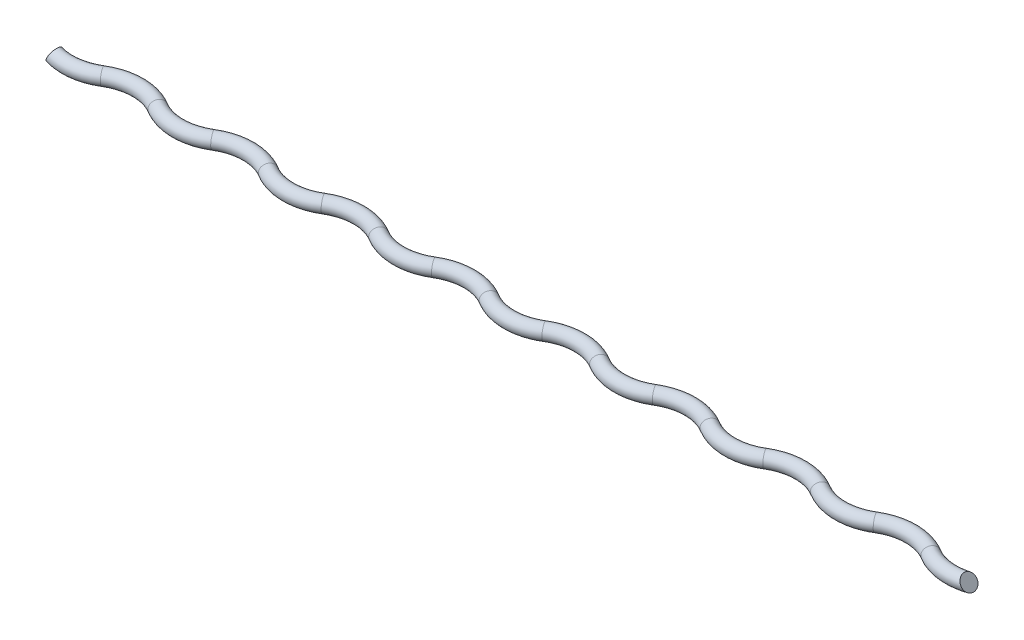
ISO-10303-21;
HEADER;
FILE_DESCRIPTION(('STEP AP214'),'2;1');
FILE_NAME('part.step','',(''),(''),'','','');
FILE_SCHEMA(('AUTOMOTIVE_DESIGN { 1 0 10303 214 1 1 1 1 }'));
ENDSEC;
DATA;
#1=APPLICATION_CONTEXT('core data for automotive mechanical design processes');
#2=APPLICATION_PROTOCOL_DEFINITION('international standard','automotive_design',2000,#1);
#3=PRODUCT_CONTEXT('',#1,'mechanical');
#4=PRODUCT('Part','Part','',(#3));
#5=PRODUCT_RELATED_PRODUCT_CATEGORY('part','',(#4));
#6=PRODUCT_DEFINITION_FORMATION('','',#4);
#7=PRODUCT_DEFINITION_CONTEXT('part definition',#1,'design');
#8=PRODUCT_DEFINITION('design','',#6,#7);
#9=PRODUCT_DEFINITION_SHAPE('','',#8);
#10=(LENGTH_UNIT() NAMED_UNIT(*) SI_UNIT(.MILLI.,.METRE.));
#11=(NAMED_UNIT(*) PLANE_ANGLE_UNIT() SI_UNIT($,.RADIAN.));
#12=(NAMED_UNIT(*) SI_UNIT($,.STERADIAN.) SOLID_ANGLE_UNIT());
#13=UNCERTAINTY_MEASURE_WITH_UNIT(LENGTH_MEASURE(1.E-05),#10,'distance_accuracy_value','');
#14=(GEOMETRIC_REPRESENTATION_CONTEXT(3) GLOBAL_UNCERTAINTY_ASSIGNED_CONTEXT((#13)) GLOBAL_UNIT_ASSIGNED_CONTEXT((#10,
#11,#12)) REPRESENTATION_CONTEXT('',''));
#15=CARTESIAN_POINT('',(0.,0.,0.));
#16=DIRECTION('',(0.,0.,1.));
#17=DIRECTION('',(1.,0.,0.));
#18=AXIS2_PLACEMENT_3D('',#15,#16,#17);
#19=CARTESIAN_POINT('',(0.,0.,29.778888860546));
#20=DIRECTION('',(0.,0.,-1.));
#21=DIRECTION('',(-1.,0.,0.));
#22=AXIS2_PLACEMENT_3D('',#19,#20,#21);
#23=CYLINDRICAL_SURFACE('',#22,6.9);
#24=CARTESIAN_POINT('',(-6.241891224204,2.940883191356,0.531991398741));
#25=CARTESIAN_POINT('',(-6.239782427795,2.945359016115,0.529307884147));
#26=CARTESIAN_POINT('',(-6.237596340689,2.949986380057,0.52714711403));
#27=CARTESIAN_POINT('',(-6.233084561044,2.959507493956,0.523749412374));
#28=CARTESIAN_POINT('',(-6.230758740171,2.964401534445,0.522513456909));
#29=CARTESIAN_POINT('',(-6.225992600269,2.974398516478,0.520930137149));
#30=CARTESIAN_POINT('',(-6.223615838161,2.979368424539,0.520594951872));
#31=CARTESIAN_POINT('',(-6.218853479753,2.989296189324,0.520718218552));
#32=CARTESIAN_POINT('',(-6.216467886433,2.994254039292,0.521177501985));
#33=CARTESIAN_POINT('',(-6.211335863558,3.004887116495,0.522968344035));
#34=CARTESIAN_POINT('',(-6.208648440606,3.010435347775,0.524395843947));
#35=CARTESIAN_POINT('',(-6.203371346104,3.021294488214,0.5280922487));
#36=CARTESIAN_POINT('',(-6.200781765213,3.026605183967,0.530361914112));
#37=CARTESIAN_POINT('',(-6.195223815227,3.037967911019,0.53623010734));
#38=CARTESIAN_POINT('',(-6.192346779357,3.043826515811,0.539920585466));
#39=CARTESIAN_POINT('',(-6.186862856724,3.054957689763,0.54826080338));
#40=CARTESIAN_POINT('',(-6.18425593003,3.060230259129,0.55291051666));
#41=CARTESIAN_POINT('',(-6.179157715177,3.070512208239,0.563615985807));
#42=CARTESIAN_POINT('',(-6.176767591055,3.075315417706,0.569583715149));
#43=CARTESIAN_POINT('',(-6.172506067445,3.083859860571,0.582394638996));
#44=CARTESIAN_POINT('',(-6.170633626801,3.087603089706,0.589236166347));
#45=CARTESIAN_POINT('',(-6.167932398996,3.092994724198,0.601936889));
#46=CARTESIAN_POINT('',(-6.166990679978,3.094871345459,0.607409853611));
#47=CARTESIAN_POINT('',(-6.165518189469,3.097803761893,0.618622134497));
#48=CARTESIAN_POINT('',(-6.164986960096,3.098860471782,0.624361153963));
#49=CARTESIAN_POINT('',(-6.164387426574,3.100052919559,0.636188019141));
#50=CARTESIAN_POINT('',(-6.164333195713,3.100160712225,0.642083739985));
#51=CARTESIAN_POINT('',(-6.164724121057,3.099383277467,0.653790627813));
#52=CARTESIAN_POINT('',(-6.165168831571,3.098498966372,0.659601872304));
#53=CARTESIAN_POINT('',(-6.166520913174,3.095807134885,0.670441518513));
#54=CARTESIAN_POINT('',(-6.167345811678,3.094163975925,0.67530992615));
#55=CARTESIAN_POINT('',(-6.169364066687,3.090137874497,0.684648124614));
#56=CARTESIAN_POINT('',(-6.170557396942,3.087755007317,0.689117953578));
#57=CARTESIAN_POINT('',(-6.173245564332,3.082376959198,0.697401122881));
#58=CARTESIAN_POINT('',(-6.174681431931,3.079500189047,0.70112028749));
#59=CARTESIAN_POINT('',(-6.177796038679,3.073247192247,0.707995327244));
#60=CARTESIAN_POINT('',(-6.179474873253,3.069870792796,0.711151002351));
#61=CARTESIAN_POINT('',(-6.183132023286,3.062498303976,0.716991720498));
#62=CARTESIAN_POINT('',(-6.185069675028,3.058583614607,0.719581022991));
#63=CARTESIAN_POINT('',(-6.189089325861,3.050441595738,0.724064672878));
#64=CARTESIAN_POINT('',(-6.191171422946,3.046214084549,0.725958603796));
#65=CARTESIAN_POINT('',(-6.195661585413,3.037071886042,0.729194100211));
#66=CARTESIAN_POINT('',(-6.198024187747,3.032247632247,0.730432954696));
#67=CARTESIAN_POINT('',(-6.202793056439,3.02248041088,0.732094414012));
#68=CARTESIAN_POINT('',(-6.205199364719,3.01753736601,0.73251644897));
#69=CARTESIAN_POINT('',(-6.210311971832,3.007002334306,0.732556469636));
#70=CARTESIAN_POINT('',(-6.212956831456,3.001533520284,0.732084668111));
#71=CARTESIAN_POINT('',(-6.218172034531,2.99071439825,0.730232650244));
#72=CARTESIAN_POINT('',(-6.220742335274,2.98536416691,0.728851861771));
#73=CARTESIAN_POINT('',(-6.226059286567,2.97426079791,0.725001114245));
#74=CARTESIAN_POINT('',(-6.228727837541,2.968667229683,0.722489155385));
#75=CARTESIAN_POINT('',(-6.233852277283,2.957891373895,0.716536346318));
#76=CARTESIAN_POINT('',(-6.236308079102,2.952709225291,0.713095169253));
#77=CARTESIAN_POINT('',(-6.241166009053,2.942427797755,0.704994841612));
#78=CARTESIAN_POINT('',(-6.24348552537,2.937501292158,0.700381994231));
#79=CARTESIAN_POINT('',(-6.24776555632,2.928387081688,0.690333628749));
#80=CARTESIAN_POINT('',(-6.249726117583,2.92419920694,0.684898284511));
#81=CARTESIAN_POINT('',(-6.253304688956,2.916538816351,0.67304742224));
#82=CARTESIAN_POINT('',(-6.254862310473,2.913195357524,0.666792936788));
#83=CARTESIAN_POINT('',(-6.257491514701,2.907543577922,0.653739815238));
#84=CARTESIAN_POINT('',(-6.258563610664,2.905234101682,0.646941780664));
#85=CARTESIAN_POINT('',(-6.260133224354,2.901850326977,0.633087795192));
#86=CARTESIAN_POINT('',(-6.260630218471,2.90077740499,0.626285863697));
#87=CARTESIAN_POINT('',(-6.26107916696,2.899808261037,0.612584275882));
#88=CARTESIAN_POINT('',(-6.261032127897,2.899909900493,0.605684797678));
#89=CARTESIAN_POINT('',(-6.260353409751,2.901374804484,0.59260838826));
#90=CARTESIAN_POINT('',(-6.259803133813,2.9025623566,0.586669241285));
#91=CARTESIAN_POINT('',(-6.258226482142,2.905960221038,0.575161125268));
#92=CARTESIAN_POINT('',(-6.257200695251,2.908169339351,0.569591719505));
#93=CARTESIAN_POINT('',(-6.254802407139,2.913323474317,0.559677936022));
#94=CARTESIAN_POINT('',(-6.253543660196,2.916025181275,0.555438398318));
#95=CARTESIAN_POINT('',(-6.250716130488,2.922081282898,0.547573930899));
#96=CARTESIAN_POINT('',(-6.249147370618,2.925435661165,0.543948980305));
#97=CARTESIAN_POINT('',(-6.24655220276,2.930970778101,0.539004244715));
#98=CARTESIAN_POINT('',(-6.245660543327,2.932870447609,0.537463377154));
#99=CARTESIAN_POINT('',(-6.243819281415,2.936788290968,0.534579504205));
#100=CARTESIAN_POINT('',(-6.242869675682,2.938806472461,0.533236511266));
#101=CARTESIAN_POINT('',(-6.241891224204,2.940883191356,0.531991398741));
#102=(BOUNDED_CURVE() B_SPLINE_CURVE(3,(#24,#25,#26,#27,#28,#29,#30,#31,#32,#33,#34,#35,#36,#37,
#38,#39,#40,#41,#42,#43,#44,#45,#46,#47,#48,#49,#50,#51,#52,#53,#54,#55,#56,#57,#58,#59,#60,#61,
#62,#63,#64,#65,#66,#67,#68,#69,#70,#71,#72,#73,#74,#75,#76,#77,#78,#79,#80,#81,#82,#83,#84,#85,
#86,#87,#88,#89,#90,#91,#92,#93,#94,#95,#96,#97,#98,#99,#100,#101),.UNSPECIFIED.,.T.,
.F.) B_SPLINE_CURVE_WITH_KNOTS((4,2,2,2,2,2,2,2,2,2,2,2,2,2,2,2,2,2,2,2,2,2,2,2,2,2,2,2,2,2,2,2,
2,2,2,2,2,2,4),(0.,0.01660543734046,0.03321087468092,0.04967014944875,0.06612942421659,
0.08501189757697,0.103894370937,0.126315963759,0.148737556581,0.172797695858,0.196857835135,
0.214345051209,0.231832267282,0.249462489139,0.267092710996,0.28261358536,0.298134459724,
0.312772644169,0.327410828613,0.342525923069,0.357641017525,0.374058472929,0.390475928334,
0.408637076379,0.426798224424,0.446750663858,0.466703103292,0.488018606402,0.509334109513,
0.531042938953,0.552751768394,0.573402723967,0.594053679539,0.612225295992,0.630396912444,
0.645834767134,0.661272621824,0.66895167405,0.676630726276),
.UNSPECIFIED.) CURVE() GEOMETRIC_REPRESENTATION_ITEM() RATIONAL_B_SPLINE_CURVE((1.,1.,1.,1.,1.,
1.,1.,1.,1.,1.,1.,1.,1.,1.,1.,1.,1.,1.,1.,1.,1.,1.,1.,1.,1.,1.,1.,1.,1.,1.,1.,1.,1.,1.,1.,1.,1.,
1.,1.,1.,1.,1.,1.,1.,1.,1.,1.,1.,1.,1.,1.,1.,1.,1.,1.,1.,1.,1.,1.,1.,1.,1.,1.,1.,1.,1.,1.,1.,1.,
1.,1.,1.,1.,1.,1.,1.,1.,1.)) REPRESENTATION_ITEM(''));
#103=CARTESIAN_POINT('',(-6.241891224204,2.940883191356,0.531991398741));
#104=VERTEX_POINT('',#103);
#105=EDGE_CURVE('E216',#104,#104,#102,.T.);
#106=ORIENTED_EDGE('',*,*,#105,.F.);
#107=EDGE_LOOP('',(#106));
#108=FACE_BOUND('',#107,.T.);
#109=ADVANCED_FACE('F17',(#108),#23,.T.);
#110=CARTESIAN_POINT('',(0.,0.,29.778888860546));
#111=DIRECTION('',(0.,0.,-1.));
#112=DIRECTION('',(-1.,0.,0.));
#113=AXIS2_PLACEMENT_3D('',#110,#111,#112);
#114=CYLINDRICAL_SURFACE('',#113,6.9);
#115=CARTESIAN_POINT('',(6.202204122049,3.02368385061,0.529231335371));
#116=CARTESIAN_POINT('',(6.198679032724,3.030914541588,0.532299487386));
#117=CARTESIAN_POINT('',(6.195323919679,3.037764642102,0.536055628824));
#118=CARTESIAN_POINT('',(6.188930936005,3.05076815899,0.544831740269));
#119=CARTESIAN_POINT('',(6.18589311299,3.056921327363,0.549852112583));
#120=CARTESIAN_POINT('',(6.180335564168,3.068140994659,0.560917559287));
#121=CARTESIAN_POINT('',(6.17788020694,3.073079992456,0.566719211057));
#122=CARTESIAN_POINT('',(6.173465678093,3.081938677641,0.579215378207));
#123=CARTESIAN_POINT('',(6.171505581997,3.08586012492,0.585908328212));
#124=CARTESIAN_POINT('',(6.168603997956,3.09165527249,0.598466672913));
#125=CARTESIAN_POINT('',(6.167564764618,3.093727253964,0.603955045603));
#126=CARTESIAN_POINT('',(6.165898840001,3.097046164098,0.615233115015));
#127=CARTESIAN_POINT('',(6.165271669903,3.098294046875,0.62102246302));
#128=CARTESIAN_POINT('',(6.164482814509,3.09986328851,0.632993634982));
#129=CARTESIAN_POINT('',(6.164338652977,3.100149840505,0.63898035452));
#130=CARTESIAN_POINT('',(6.164562528029,3.099704647251,0.650903984854));
#131=CARTESIAN_POINT('',(6.164930058598,3.098973938814,0.656840946061));
#132=CARTESIAN_POINT('',(6.166149700691,3.096546378579,0.667917069663));
#133=CARTESIAN_POINT('',(6.166916313922,3.095019827984,0.672886753336));
#134=CARTESIAN_POINT('',(6.16883051755,3.091202776312,0.682444581769));
#135=CARTESIAN_POINT('',(6.169978060766,3.088912393019,0.687032783038));
#136=CARTESIAN_POINT('',(6.17257997606,3.083709509084,0.695523951409));
#137=CARTESIAN_POINT('',(6.173972376191,3.080921401303,0.699331237386));
#138=CARTESIAN_POINT('',(6.177008658206,3.074829364277,0.70639367938));
#139=CARTESIAN_POINT('',(6.178652631779,3.071525269968,0.709648653903));
#140=CARTESIAN_POINT('',(6.182237632455,3.064303271212,0.715683691667));
#141=CARTESIAN_POINT('',(6.184137553134,3.060467712877,0.718368854233));
#142=CARTESIAN_POINT('',(6.188089416231,3.052469373209,0.723054446122));
#143=CARTESIAN_POINT('',(6.190141458912,3.048306406043,0.725054474866));
#144=CARTESIAN_POINT('',(6.194570554256,3.039296448256,0.728516511375));
#145=CARTESIAN_POINT('',(6.19690307645,3.034538039985,0.729875865091));
#146=CARTESIAN_POINT('',(6.201620372596,3.024885718375,0.731787383389));
#147=CARTESIAN_POINT('',(6.204005194557,3.019991716421,0.732338986196));
#148=CARTESIAN_POINT('',(6.209080083102,3.009545100732,0.732661666803));
#149=CARTESIAN_POINT('',(6.211710164511,3.004112608814,0.73234080011));
#150=CARTESIAN_POINT('',(6.21690606657,2.993345067608,0.73079608099));
#151=CARTESIAN_POINT('',(6.219471851098,2.988010083395,0.729571648573));
#152=CARTESIAN_POINT('',(6.224793792604,2.976908435207,0.72605352317));
#153=CARTESIAN_POINT('',(6.22747292541,2.971298866097,0.723712489844));
#154=CARTESIAN_POINT('',(6.232630148949,2.960465742885,0.718099244476));
#155=CARTESIAN_POINT('',(6.235108152036,2.955242331736,0.714826675446));
#156=CARTESIAN_POINT('',(6.240032121583,2.944831846736,0.70706299833));
#157=CARTESIAN_POINT('',(6.242395045828,2.939818119609,0.702609788717));
#158=CARTESIAN_POINT('',(6.246773378287,2.930503172646,0.692866281008));
#159=CARTESIAN_POINT('',(6.248788811509,2.926201830166,0.687576111355));
#160=CARTESIAN_POINT('',(6.252500165848,2.918263407532,0.675978982158));
#161=CARTESIAN_POINT('',(6.254132609608,2.914761775619,0.669823740073));
#162=CARTESIAN_POINT('',(6.256919946433,2.908773571646,0.656939968258));
#163=CARTESIAN_POINT('',(6.258075303847,2.906285945573,0.650212027014));
#164=CARTESIAN_POINT('',(6.259824026743,2.902517404299,0.636424317528));
#165=CARTESIAN_POINT('',(6.260410714041,2.901251152816,0.629613875942));
#166=CARTESIAN_POINT('',(6.261039686279,2.899893550982,0.615855462045));
#167=CARTESIAN_POINT('',(6.261082963092,2.899800086363,0.608907737768));
#168=CARTESIAN_POINT('',(6.26057463685,2.900897367847,0.595662410389));
#169=CARTESIAN_POINT('',(6.260098516985,2.901925133624,0.589609574808));
#170=CARTESIAN_POINT('',(6.258659608224,2.905027165432,0.577842395181));
#171=CARTESIAN_POINT('',(6.257697469821,2.907100105582,0.572127618093));
#172=CARTESIAN_POINT('',(6.255404498559,2.912030355756,0.561916315669));
#173=CARTESIAN_POINT('',(6.254188171226,2.914642506847,0.557535466958));
#174=CARTESIAN_POINT('',(6.251431742909,2.920549911844,0.549378647295));
#175=CARTESIAN_POINT('',(6.249891687793,2.923845103156,0.545602615433));
#176=CARTESIAN_POINT('',(6.246635936409,2.930793869284,0.539032534331));
#177=CARTESIAN_POINT('',(6.244999784194,2.93427914328,0.536273751374));
#178=CARTESIAN_POINT('',(6.241551653523,2.941606593628,0.5314178446));
#179=CARTESIAN_POINT('',(6.239739605465,2.945448931347,0.529321012931));
#180=CARTESIAN_POINT('',(6.235901000342,2.953567214007,0.525742997826));
#181=CARTESIAN_POINT('',(6.23392003711,2.957746287819,0.524320624486));
#182=CARTESIAN_POINT('',(6.229881003431,2.966244227178,0.522165084958));
#183=CARTESIAN_POINT('',(6.227822885463,2.970563200113,0.521432426473));
#184=CARTESIAN_POINT('',(6.223351329312,2.979920906046,0.520566670618));
#185=CARTESIAN_POINT('',(6.220980575383,2.984866916522,0.520536183486));
#186=CARTESIAN_POINT('',(6.216247557446,2.994711360579,0.52123171015));
#187=CARTESIAN_POINT('',(6.213885311662,2.999609752716,0.521958459155));
#188=CARTESIAN_POINT('',(6.209940071316,3.007766212943,0.523773961603));
#189=CARTESIAN_POINT('',(6.208370284013,3.011004992523,0.524659958055));
#190=CARTESIAN_POINT('',(6.205263066567,3.01740334114,0.526726470327));
#191=CARTESIAN_POINT('',(6.20372564265,3.020562895573,0.527907040844));
#192=CARTESIAN_POINT('',(6.202204122049,3.02368385061,0.529231335371));
#193=(BOUNDED_CURVE() B_SPLINE_CURVE(3,(#115,#116,#117,#118,#119,#120,#121,#122,#123,#124,#125,
#126,#127,#128,#129,#130,#131,#132,#133,#134,#135,#136,#137,#138,#139,#140,#141,#142,#143,#144,
#145,#146,#147,#148,#149,#150,#151,#152,#153,#154,#155,#156,#157,#158,#159,#160,#161,#162,#163,
#164,#165,#166,#167,#168,#169,#170,#171,#172,#173,#174,#175,#176,#177,#178,#179,#180,#181,#182,
#183,#184,#185,#186,#187,#188,#189,#190,#191,#192),.UNSPECIFIED.,.T.,
.F.) B_SPLINE_CURVE_WITH_KNOTS((4,2,2,2,2,2,2,2,2,2,2,2,2,2,2,2,2,2,2,2,2,2,2,2,2,2,2,2,2,2,2,2,
2,2,2,2,2,2,4),(0.,0.02541080623336,0.05082161246671,0.07473532044338,0.09864902842004,
0.116366403749,0.134083779077,0.151953688241,0.169823597404,0.185447858732,0.20107212006,
0.215673827527,0.230275534993,0.245265915272,0.260256295551,0.276493847349,0.292731399147,
0.310685119283,0.328638839419,0.348390380794,0.36814192217,0.38930551459,0.410469107009,
0.432122217796,0.453775328582,0.474500310439,0.495225292296,0.513566325309,0.531907358322,
0.547479123955,0.563050889589,0.577079373177,0.591107856765,0.605425469013,0.61974308126,
0.63597976239,0.65221644352,0.663141409037,0.674066374554),
.UNSPECIFIED.) CURVE() GEOMETRIC_REPRESENTATION_ITEM() RATIONAL_B_SPLINE_CURVE((1.,1.,1.,1.,1.,
1.,1.,1.,1.,1.,1.,1.,1.,1.,1.,1.,1.,1.,1.,1.,1.,1.,1.,1.,1.,1.,1.,1.,1.,1.,1.,1.,1.,1.,1.,1.,1.,
1.,1.,1.,1.,1.,1.,1.,1.,1.,1.,1.,1.,1.,1.,1.,1.,1.,1.,1.,1.,1.,1.,1.,1.,1.,1.,1.,1.,1.,1.,1.,1.,
1.,1.,1.,1.,1.,1.,1.,1.,1.)) REPRESENTATION_ITEM(''));
#194=CARTESIAN_POINT('',(6.202204122049,3.02368385061,0.529231335371));
#195=VERTEX_POINT('',#194);
#196=EDGE_CURVE('E30',#195,#195,#193,.T.);
#197=ORIENTED_EDGE('',*,*,#196,.T.);
#198=EDGE_LOOP('',(#197));
#199=FACE_BOUND('',#198,.T.);
#200=ADVANCED_FACE('F470',(#199),#114,.T.);
#201=CARTESIAN_POINT('',(6.,3.,-0.06214285714286));
#202=DIRECTION('',(0.,1.,0.));
#203=DIRECTION('',(0.,0.,1.));
#204=AXIS2_PLACEMENT_3D('',#201,#202,#203);
#205=TOROIDAL_SURFACE('',#204,0.722142857143,0.1);
#206=ORIENTED_EDGE('',*,*,#196,.F.);
#207=CARTESIAN_POINT('',(5.67545135924,3.02368385061,0.471971477364));
#208=CARTESIAN_POINT('',(5.76897244613,3.02368385061,0.52879852669));
#209=CARTESIAN_POINT('',(5.874929829952,3.02368385061,0.565165346776));
#210=CARTESIAN_POINT('',(5.987360470787,3.02368385061,0.577386948606));
#211=CARTESIAN_POINT('',(6.098657084141,3.02368385061,0.564636393887));
#212=CARTESIAN_POINT('',(6.202204122049,3.02368385061,0.529231335371));
#213=(BOUNDED_CURVE() B_SPLINE_CURVE(5,(#207,#208,#209,#210,#211,#212),.UNSPECIFIED.,.F.,
.F.) B_SPLINE_CURVE_WITH_KNOTS((6,6),(-0.546017406173,0.329460753161),
.UNSPECIFIED.) CURVE() GEOMETRIC_REPRESENTATION_ITEM() RATIONAL_B_SPLINE_CURVE((1.,1.,1.,1.,1.,1.)) REPRESENTATION_ITEM(''));
#214=CARTESIAN_POINT('',(5.67545135924,3.02368385061,0.471971477364));
#215=VERTEX_POINT('',#214);
#216=EDGE_CURVE('E11',#215,#195,#213,.T.);
#217=ORIENTED_EDGE('',*,*,#216,.F.);
#218=CARTESIAN_POINT('',(5.625,3.,0.555));
#219=DIRECTION('',(0.854599406528091,0.,0.519287833828056));
#220=DIRECTION('',(0.519287833828056,0.,-0.854599406528091));
#221=AXIS2_PLACEMENT_3D('',#218,#219,#220);
#222=CIRCLE('',#221,0.1);
#223=CARTESIAN_POINT('',(5.676928783383,3.,0.469540059347));
#224=VERTEX_POINT('',#223);
#225=EDGE_CURVE('E175',#215,#224,#222,.T.);
#226=ORIENTED_EDGE('',*,*,#225,.T.);
#227=CARTESIAN_POINT('',(5.625,3.,0.555));
#228=DIRECTION('',(0.854599406528091,0.,0.519287833828056));
#229=DIRECTION('',(0.519287833828056,0.,-0.854599406528091));
#230=AXIS2_PLACEMENT_3D('',#227,#228,#229);
#231=CIRCLE('',#230,0.1);
#232=EDGE_CURVE('E178',#224,#215,#231,.T.);
#233=ORIENTED_EDGE('',*,*,#232,.T.);
#234=ORIENTED_EDGE('',*,*,#216,.T.);
#235=EDGE_LOOP('',(#206,#217,#226,#233,#234));
#236=FACE_BOUND('',#235,.T.);
#237=ADVANCED_FACE('F474',(#236),#205,.T.);
#238=CARTESIAN_POINT('',(5.25,3.,1.172142857143));
#239=DIRECTION('',(0.,-1.,0.));
#240=DIRECTION('',(0.,0.,-1.));
#241=AXIS2_PLACEMENT_3D('',#238,#239,#240);
#242=TOROIDAL_SURFACE('',#241,0.722142857143,0.1);
#243=CARTESIAN_POINT('',(4.875,3.,0.555));
#244=DIRECTION('',(0.854599406528091,0.,-0.519287833828056));
#245=DIRECTION('',(-0.519287833828056,0.,-0.854599406528091));
#246=AXIS2_PLACEMENT_3D('',#243,#244,#245);
#247=CIRCLE('',#246,0.1);
#248=CARTESIAN_POINT('',(4.823071216617,3.,0.469540059347));
#249=VERTEX_POINT('',#248);
#250=EDGE_CURVE('E165',#249,#249,#247,.T.);
#251=ORIENTED_EDGE('',*,*,#250,.T.);
#252=CARTESIAN_POINT('',(4.823071216617,3.,0.469540059347));
#253=CARTESIAN_POINT('',(4.976524559506,3.,0.376295840578));
#254=CARTESIAN_POINT('',(5.155431518956,3.,0.32490242308));
#255=CARTESIAN_POINT('',(5.344568481044,3.,0.32490242308));
#256=CARTESIAN_POINT('',(5.523475440494,3.,0.376295840578));
#257=CARTESIAN_POINT('',(5.676928783383,3.,0.469540059347));
#258=(BOUNDED_CURVE() B_SPLINE_CURVE(5,(#252,#253,#254,#255,#256,#257),.UNSPECIFIED.,.F.,
.F.) B_SPLINE_CURVE_WITH_KNOTS((6,6),(5.737167901006,6.829202713353),
.UNSPECIFIED.) CURVE() GEOMETRIC_REPRESENTATION_ITEM() RATIONAL_B_SPLINE_CURVE((1.,1.,1.,1.,1.,1.)) REPRESENTATION_ITEM(''));
#259=EDGE_CURVE('E179',#249,#224,#258,.T.);
#260=ORIENTED_EDGE('',*,*,#259,.T.);
#261=ORIENTED_EDGE('',*,*,#225,.F.);
#262=ORIENTED_EDGE('',*,*,#232,.F.);
#263=ORIENTED_EDGE('',*,*,#259,.F.);
#264=EDGE_LOOP('',(#251,#260,#261,#262,#263));
#265=FACE_BOUND('',#264,.T.);
#266=ADVANCED_FACE('F493',(#265),#242,.T.);
#267=CARTESIAN_POINT('',(4.5,3.,-0.06214285714286));
#268=DIRECTION('',(0.,1.,0.));
#269=DIRECTION('',(0.,0.,1.));
#270=AXIS2_PLACEMENT_3D('',#267,#268,#269);
#271=TOROIDAL_SURFACE('',#270,0.722142857143,0.1);
#272=CARTESIAN_POINT('',(4.125,3.,0.555));
#273=DIRECTION('',(0.854599406528091,0.,0.519287833828056));
#274=DIRECTION('',(0.519287833828056,0.,-0.854599406528091));
#275=AXIS2_PLACEMENT_3D('',#272,#273,#274);
#276=CIRCLE('',#275,0.1);
#277=CARTESIAN_POINT('',(4.176928783383,3.,0.469540059347));
#278=VERTEX_POINT('',#277);
#279=EDGE_CURVE('E166',#278,#278,#276,.T.);
#280=ORIENTED_EDGE('',*,*,#279,.T.);
#281=CARTESIAN_POINT('',(4.176928783383,3.,0.469540059347));
#282=CARTESIAN_POINT('',(4.29305203417,3.,0.54010106243));
#283=CARTESIAN_POINT('',(4.428436883589,3.,0.578992171588));
#284=CARTESIAN_POINT('',(4.571563116411,3.,0.578992171588));
#285=CARTESIAN_POINT('',(4.70694796583,3.,0.54010106243));
#286=CARTESIAN_POINT('',(4.823071216617,3.,0.469540059347));
#287=(BOUNDED_CURVE() B_SPLINE_CURVE(5,(#281,#282,#283,#284,#285,#286),.UNSPECIFIED.,.F.,
.F.) B_SPLINE_CURVE_WITH_KNOTS((6,6),(5.737167901006,6.829202713353),
.UNSPECIFIED.) CURVE() GEOMETRIC_REPRESENTATION_ITEM() RATIONAL_B_SPLINE_CURVE((1.,1.,1.,1.,1.,1.)) REPRESENTATION_ITEM(''));
#288=EDGE_CURVE('E156',#278,#249,#287,.T.);
#289=ORIENTED_EDGE('',*,*,#288,.T.);
#290=ORIENTED_EDGE('',*,*,#250,.F.);
#291=ORIENTED_EDGE('',*,*,#288,.F.);
#292=EDGE_LOOP('',(#280,#289,#290,#291));
#293=FACE_BOUND('',#292,.T.);
#294=ADVANCED_FACE('F497',(#293),#271,.T.);
#295=CARTESIAN_POINT('',(3.75,3.,1.172142857143));
#296=DIRECTION('',(0.,-1.,0.));
#297=DIRECTION('',(0.,0.,-1.));
#298=AXIS2_PLACEMENT_3D('',#295,#296,#297);
#299=TOROIDAL_SURFACE('',#298,0.722142857143,0.1);
#300=CARTESIAN_POINT('',(3.375,3.,0.555));
#301=DIRECTION('',(0.854599406528091,0.,-0.519287833828056));
#302=DIRECTION('',(-0.519287833828056,0.,-0.854599406528091));
#303=AXIS2_PLACEMENT_3D('',#300,#301,#302);
#304=CIRCLE('',#303,0.1);
#305=CARTESIAN_POINT('',(3.323071216617,3.,0.469540059347));
#306=VERTEX_POINT('',#305);
#307=EDGE_CURVE('E237',#306,#306,#304,.T.);
#308=ORIENTED_EDGE('',*,*,#307,.T.);
#309=CARTESIAN_POINT('',(3.323071216617,3.,0.469540059347));
#310=CARTESIAN_POINT('',(3.476524559506,3.,0.376295840578));
#311=CARTESIAN_POINT('',(3.655431518956,3.,0.32490242308));
#312=CARTESIAN_POINT('',(3.844568481044,3.,0.32490242308));
#313=CARTESIAN_POINT('',(4.023475440494,3.,0.376295840578));
#314=CARTESIAN_POINT('',(4.176928783383,3.,0.469540059347));
#315=(BOUNDED_CURVE() B_SPLINE_CURVE(5,(#309,#310,#311,#312,#313,#314),.UNSPECIFIED.,.F.,
.F.) B_SPLINE_CURVE_WITH_KNOTS((6,6),(5.737167901006,6.829202713353),
.UNSPECIFIED.) CURVE() GEOMETRIC_REPRESENTATION_ITEM() RATIONAL_B_SPLINE_CURVE((1.,1.,1.,1.,1.,1.)) REPRESENTATION_ITEM(''));
#316=EDGE_CURVE('E243',#306,#278,#315,.T.);
#317=ORIENTED_EDGE('',*,*,#316,.T.);
#318=ORIENTED_EDGE('',*,*,#279,.F.);
#319=ORIENTED_EDGE('',*,*,#316,.F.);
#320=EDGE_LOOP('',(#308,#317,#318,#319));
#321=FACE_BOUND('',#320,.T.);
#322=ADVANCED_FACE('F516',(#321),#299,.T.);
#323=CARTESIAN_POINT('',(3.,3.,-0.06214285714286));
#324=DIRECTION('',(0.,1.,0.));
#325=DIRECTION('',(0.,0.,1.));
#326=AXIS2_PLACEMENT_3D('',#323,#324,#325);
#327=TOROIDAL_SURFACE('',#326,0.722142857143,0.1);
#328=CARTESIAN_POINT('',(2.625,3.,0.555));
#329=DIRECTION('',(0.854599406528091,0.,0.519287833828056));
#330=DIRECTION('',(0.519287833828056,0.,-0.854599406528091));
#331=AXIS2_PLACEMENT_3D('',#328,#329,#330);
#332=CIRCLE('',#331,0.1);
#333=CARTESIAN_POINT('',(2.676928783383,3.,0.469540059347));
#334=VERTEX_POINT('',#333);
#335=EDGE_CURVE('E181',#334,#334,#332,.T.);
#336=ORIENTED_EDGE('',*,*,#335,.T.);
#337=CARTESIAN_POINT('',(2.676928783383,3.,0.469540059347));
#338=CARTESIAN_POINT('',(2.79305203417,3.,0.54010106243));
#339=CARTESIAN_POINT('',(2.928436883589,3.,0.578992171588));
#340=CARTESIAN_POINT('',(3.071563116411,3.,0.578992171588));
#341=CARTESIAN_POINT('',(3.20694796583,3.,0.54010106243));
#342=CARTESIAN_POINT('',(3.323071216617,3.,0.469540059347));
#343=(BOUNDED_CURVE() B_SPLINE_CURVE(5,(#337,#338,#339,#340,#341,#342),.UNSPECIFIED.,.F.,
.F.) B_SPLINE_CURVE_WITH_KNOTS((6,6),(5.737167901006,6.829202713353),
.UNSPECIFIED.) CURVE() GEOMETRIC_REPRESENTATION_ITEM() RATIONAL_B_SPLINE_CURVE((1.,1.,1.,1.,1.,1.)) REPRESENTATION_ITEM(''));
#344=EDGE_CURVE('E185',#334,#306,#343,.T.);
#345=ORIENTED_EDGE('',*,*,#344,.T.);
#346=ORIENTED_EDGE('',*,*,#307,.F.);
#347=ORIENTED_EDGE('',*,*,#344,.F.);
#348=EDGE_LOOP('',(#336,#345,#346,#347));
#349=FACE_BOUND('',#348,.T.);
#350=ADVANCED_FACE('F520',(#349),#327,.T.);
#351=CARTESIAN_POINT('',(2.25,3.,1.172142857143));
#352=DIRECTION('',(0.,-1.,0.));
#353=DIRECTION('',(0.,0.,-1.));
#354=AXIS2_PLACEMENT_3D('',#351,#352,#353);
#355=TOROIDAL_SURFACE('',#354,0.722142857143,0.1);
#356=CARTESIAN_POINT('',(1.875,3.,0.555));
#357=DIRECTION('',(0.854599406528091,0.,-0.519287833828056));
#358=DIRECTION('',(-0.519287833828056,0.,-0.854599406528091));
#359=AXIS2_PLACEMENT_3D('',#356,#357,#358);
#360=CIRCLE('',#359,0.1);
#361=CARTESIAN_POINT('',(1.823071216617,3.,0.469540059347));
#362=VERTEX_POINT('',#361);
#363=EDGE_CURVE('E191',#362,#362,#360,.T.);
#364=ORIENTED_EDGE('',*,*,#363,.T.);
#365=CARTESIAN_POINT('',(1.823071216617,3.,0.469540059347));
#366=CARTESIAN_POINT('',(1.976524559506,3.,0.376295840578));
#367=CARTESIAN_POINT('',(2.155431518956,3.,0.32490242308));
#368=CARTESIAN_POINT('',(2.344568481044,3.,0.32490242308));
#369=CARTESIAN_POINT('',(2.523475440494,3.,0.376295840578));
#370=CARTESIAN_POINT('',(2.676928783383,3.,0.469540059347));
#371=(BOUNDED_CURVE() B_SPLINE_CURVE(5,(#365,#366,#367,#368,#369,#370),.UNSPECIFIED.,.F.,
.F.) B_SPLINE_CURVE_WITH_KNOTS((6,6),(5.737167901006,6.829202713353),
.UNSPECIFIED.) CURVE() GEOMETRIC_REPRESENTATION_ITEM() RATIONAL_B_SPLINE_CURVE((1.,1.,1.,1.,1.,1.)) REPRESENTATION_ITEM(''));
#372=EDGE_CURVE('E186',#362,#334,#371,.T.);
#373=ORIENTED_EDGE('',*,*,#372,.T.);
#374=ORIENTED_EDGE('',*,*,#335,.F.);
#375=ORIENTED_EDGE('',*,*,#372,.F.);
#376=EDGE_LOOP('',(#364,#373,#374,#375));
#377=FACE_BOUND('',#376,.T.);
#378=ADVANCED_FACE('F508',(#377),#355,.T.);
#379=CARTESIAN_POINT('',(1.5,3.,-0.06214285714286));
#380=DIRECTION('',(0.,-1.,0.));
#381=DIRECTION('',(0.,0.,-1.));
#382=AXIS2_PLACEMENT_3D('',#379,#380,#381);
#383=TOROIDAL_SURFACE('',#382,0.722142857143,0.1);
#384=ORIENTED_EDGE('',*,*,#363,.F.);
#385=CARTESIAN_POINT('',(1.823071216617,3.,0.469540059347));
#386=CARTESIAN_POINT('',(1.70694796583,3.,0.54010106243));
#387=CARTESIAN_POINT('',(1.571563116411,3.,0.578992171588));
#388=CARTESIAN_POINT('',(1.428436883589,3.,0.578992171588));
#389=CARTESIAN_POINT('',(1.29305203417,3.,0.54010106243));
#390=CARTESIAN_POINT('',(1.176928783383,3.,0.469540059347));
#391=(BOUNDED_CURVE() B_SPLINE_CURVE(5,(#385,#386,#387,#388,#389,#390),.UNSPECIFIED.,.F.,
.F.) B_SPLINE_CURVE_WITH_KNOTS((6,6),(2.595575247416,3.687610059763),
.UNSPECIFIED.) CURVE() GEOMETRIC_REPRESENTATION_ITEM() RATIONAL_B_SPLINE_CURVE((1.,1.,1.,1.,1.,1.)) REPRESENTATION_ITEM(''));
#392=CARTESIAN_POINT('',(1.176928783383,3.,0.469540059347));
#393=VERTEX_POINT('',#392);
#394=EDGE_CURVE('E224',#362,#393,#391,.T.);
#395=ORIENTED_EDGE('',*,*,#394,.T.);
#396=CARTESIAN_POINT('',(1.125,3.,0.555));
#397=DIRECTION('',(0.854599406528091,0.,0.519287833828056));
#398=DIRECTION('',(0.519287833828056,0.,-0.854599406528091));
#399=AXIS2_PLACEMENT_3D('',#396,#397,#398);
#400=CIRCLE('',#399,0.1);
#401=EDGE_CURVE('E187',#393,#393,#400,.T.);
#402=ORIENTED_EDGE('',*,*,#401,.T.);
#403=ORIENTED_EDGE('',*,*,#394,.F.);
#404=EDGE_LOOP('',(#384,#395,#402,#403));
#405=FACE_BOUND('',#404,.T.);
#406=ADVANCED_FACE('F485',(#405),#383,.T.);
#407=CARTESIAN_POINT('',(0.75,3.,1.172142857143));
#408=DIRECTION('',(0.,-1.,0.));
#409=DIRECTION('',(0.,0.,-1.));
#410=AXIS2_PLACEMENT_3D('',#407,#408,#409);
#411=TOROIDAL_SURFACE('',#410,0.722142857143,0.1);
#412=CARTESIAN_POINT('',(0.375,3.,0.555));
#413=DIRECTION('',(0.854599406528091,0.,-0.519287833828056));
#414=DIRECTION('',(-0.519287833828056,0.,-0.854599406528091));
#415=AXIS2_PLACEMENT_3D('',#412,#413,#414);
#416=CIRCLE('',#415,0.1);
#417=CARTESIAN_POINT('',(0.323071216617,3.,0.469540059347));
#418=VERTEX_POINT('',#417);
#419=EDGE_CURVE('E253',#418,#418,#416,.T.);
#420=ORIENTED_EDGE('',*,*,#419,.T.);
#421=CARTESIAN_POINT('',(0.323071216617,3.,0.469540059347));
#422=CARTESIAN_POINT('',(0.476524559506,3.,0.376295840578));
#423=CARTESIAN_POINT('',(0.655431518956,3.,0.32490242308));
#424=CARTESIAN_POINT('',(0.844568481044,3.,0.32490242308));
#425=CARTESIAN_POINT('',(1.023475440494,3.,0.376295840578));
#426=CARTESIAN_POINT('',(1.176928783383,3.,0.469540059347));
#427=(BOUNDED_CURVE() B_SPLINE_CURVE(5,(#421,#422,#423,#424,#425,#426),.UNSPECIFIED.,.F.,
.F.) B_SPLINE_CURVE_WITH_KNOTS((6,6),(5.737167901006,6.829202713353),
.UNSPECIFIED.) CURVE() GEOMETRIC_REPRESENTATION_ITEM() RATIONAL_B_SPLINE_CURVE((1.,1.,1.,1.,1.,1.)) REPRESENTATION_ITEM(''));
#428=EDGE_CURVE('E192',#418,#393,#427,.T.);
#429=ORIENTED_EDGE('',*,*,#428,.T.);
#430=ORIENTED_EDGE('',*,*,#401,.F.);
#431=ORIENTED_EDGE('',*,*,#428,.F.);
#432=EDGE_LOOP('',(#420,#429,#430,#431));
#433=FACE_BOUND('',#432,.T.);
#434=ADVANCED_FACE('F462',(#433),#411,.T.);
#435=CARTESIAN_POINT('',(0.,3.,-0.06214285714286));
#436=DIRECTION('',(0.,1.,0.));
#437=DIRECTION('',(0.,0.,1.));
#438=AXIS2_PLACEMENT_3D('',#435,#436,#437);
#439=TOROIDAL_SURFACE('',#438,0.722142857143,0.1);
#440=CARTESIAN_POINT('',(-0.375,3.,0.555));
#441=DIRECTION('',(0.854599406528091,0.,0.519287833828056));
#442=DIRECTION('',(0.519287833828056,0.,-0.854599406528091));
#443=AXIS2_PLACEMENT_3D('',#440,#441,#442);
#444=CIRCLE('',#443,0.1);
#445=CARTESIAN_POINT('',(-0.323071216617,3.,0.469540059347));
#446=VERTEX_POINT('',#445);
#447=EDGE_CURVE('E136',#446,#446,#444,.T.);
#448=ORIENTED_EDGE('',*,*,#447,.T.);
#449=CARTESIAN_POINT('',(-0.323071216617,3.,0.469540059347));
#450=CARTESIAN_POINT('',(-0.20694796583,3.,0.54010106243));
#451=CARTESIAN_POINT('',(-0.07156311641088,3.,0.578992171588));
#452=CARTESIAN_POINT('',(0.07156311641088,3.,0.578992171588));
#453=CARTESIAN_POINT('',(0.20694796583,3.,0.54010106243));
#454=CARTESIAN_POINT('',(0.323071216617,3.,0.469540059347));
#455=(BOUNDED_CURVE() B_SPLINE_CURVE(5,(#449,#450,#451,#452,#453,#454),.UNSPECIFIED.,.F.,
.F.) B_SPLINE_CURVE_WITH_KNOTS((6,6),(5.737167901006,6.829202713353),
.UNSPECIFIED.) CURVE() GEOMETRIC_REPRESENTATION_ITEM() RATIONAL_B_SPLINE_CURVE((1.,1.,1.,1.,1.,1.)) REPRESENTATION_ITEM(''));
#456=EDGE_CURVE('E260',#446,#418,#455,.T.);
#457=ORIENTED_EDGE('',*,*,#456,.T.);
#458=ORIENTED_EDGE('',*,*,#419,.F.);
#459=ORIENTED_EDGE('',*,*,#456,.F.);
#460=EDGE_LOOP('',(#448,#457,#458,#459));
#461=FACE_BOUND('',#460,.T.);
#462=ADVANCED_FACE('F458',(#461),#439,.T.);
#463=CARTESIAN_POINT('',(-6.,3.,-0.06214285714286));
#464=DIRECTION('',(0.,-1.,0.));
#465=DIRECTION('',(0.,0.,-1.));
#466=AXIS2_PLACEMENT_3D('',#463,#464,#465);
#467=TOROIDAL_SURFACE('',#466,0.722142857143,0.1);
#468=ORIENTED_EDGE('',*,*,#105,.T.);
#469=CARTESIAN_POINT('',(-5.666883076251,2.940883191356,0.486072423084));
#470=CARTESIAN_POINT('',(-5.769142453629,2.940883191356,0.548209197532));
#471=CARTESIAN_POINT('',(-5.885888117421,2.940883191356,0.586515805382));
#472=CARTESIAN_POINT('',(-6.009721053148,2.940883191356,0.596404850574));
#473=CARTESIAN_POINT('',(-6.131066514867,2.940883191356,0.577111713465));
#474=CARTESIAN_POINT('',(-6.241891224204,2.940883191356,0.531991398741));
#475=(BOUNDED_CURVE() B_SPLINE_CURVE(5,(#469,#470,#471,#472,#473,#474),.UNSPECIFIED.,.F.,
.F.) B_SPLINE_CURVE_WITH_KNOTS((6,6),(2.595575247416,3.528232371961),
.UNSPECIFIED.) CURVE() GEOMETRIC_REPRESENTATION_ITEM() RATIONAL_B_SPLINE_CURVE((1.,1.,1.,1.,1.,1.)) REPRESENTATION_ITEM(''));
#476=CARTESIAN_POINT('',(-5.666883076251,2.940883191356,0.486072423084));
#477=VERTEX_POINT('',#476);
#478=EDGE_CURVE('E301',#477,#104,#475,.T.);
#479=ORIENTED_EDGE('',*,*,#478,.F.);
#480=CARTESIAN_POINT('',(-5.625,3.,0.555));
#481=DIRECTION('',(0.854599406528091,0.,-0.519287833828056));
#482=DIRECTION('',(-0.519287833828056,0.,-0.854599406528091));
#483=AXIS2_PLACEMENT_3D('',#480,#481,#482);
#484=CIRCLE('',#483,0.1);
#485=CARTESIAN_POINT('',(-5.676928783383,3.,0.469540059347));
#486=VERTEX_POINT('',#485);
#487=EDGE_CURVE('E246',#486,#477,#484,.T.);
#488=ORIENTED_EDGE('',*,*,#487,.F.);
#489=CARTESIAN_POINT('',(-5.625,3.,0.555));
#490=DIRECTION('',(0.854599406528091,0.,-0.519287833828056));
#491=DIRECTION('',(-0.519287833828056,0.,-0.854599406528091));
#492=AXIS2_PLACEMENT_3D('',#489,#490,#491);
#493=CIRCLE('',#492,0.1);
#494=EDGE_CURVE('E217',#477,#486,#493,.T.);
#495=ORIENTED_EDGE('',*,*,#494,.F.);
#496=ORIENTED_EDGE('',*,*,#478,.T.);
#497=EDGE_LOOP('',(#468,#479,#488,#495,#496));
#498=FACE_BOUND('',#497,.T.);
#499=ADVANCED_FACE('F352',(#498),#467,.T.);
#500=CARTESIAN_POINT('',(-5.25,3.,1.172142857143));
#501=DIRECTION('',(0.,-1.,0.));
#502=DIRECTION('',(0.,0.,-1.));
#503=AXIS2_PLACEMENT_3D('',#500,#501,#502);
#504=TOROIDAL_SURFACE('',#503,0.722142857143,0.1);
#505=ORIENTED_EDGE('',*,*,#487,.T.);
#506=ORIENTED_EDGE('',*,*,#494,.T.);
#507=CARTESIAN_POINT('',(-5.676928783383,3.,0.469540059347));
#508=CARTESIAN_POINT('',(-5.523475440494,3.,0.376295840578));
#509=CARTESIAN_POINT('',(-5.344568481044,3.,0.32490242308));
#510=CARTESIAN_POINT('',(-5.155431518956,3.,0.32490242308));
#511=CARTESIAN_POINT('',(-4.976524559506,3.,0.376295840578));
#512=CARTESIAN_POINT('',(-4.823071216617,3.,0.469540059347));
#513=(BOUNDED_CURVE() B_SPLINE_CURVE(5,(#507,#508,#509,#510,#511,#512),.UNSPECIFIED.,.F.,
.F.) B_SPLINE_CURVE_WITH_KNOTS((6,6),(5.737167901006,6.829202713353),
.UNSPECIFIED.) CURVE() GEOMETRIC_REPRESENTATION_ITEM() RATIONAL_B_SPLINE_CURVE((1.,1.,1.,1.,1.,1.)) REPRESENTATION_ITEM(''));
#514=CARTESIAN_POINT('',(-4.823071216617,3.,0.469540059347));
#515=VERTEX_POINT('',#514);
#516=EDGE_CURVE('E103',#486,#515,#513,.T.);
#517=ORIENTED_EDGE('',*,*,#516,.T.);
#518=CARTESIAN_POINT('',(-4.875,3.,0.555));
#519=DIRECTION('',(0.854599406528091,0.,0.519287833828056));
#520=DIRECTION('',(0.519287833828056,0.,-0.854599406528091));
#521=AXIS2_PLACEMENT_3D('',#518,#519,#520);
#522=CIRCLE('',#521,0.1);
#523=EDGE_CURVE('E251',#515,#515,#522,.T.);
#524=ORIENTED_EDGE('',*,*,#523,.F.);
#525=ORIENTED_EDGE('',*,*,#516,.F.);
#526=EDGE_LOOP('',(#505,#506,#517,#524,#525));
#527=FACE_BOUND('',#526,.T.);
#528=ADVANCED_FACE('F355',(#527),#504,.T.);
#529=CARTESIAN_POINT('',(-4.5,3.,-0.06214285714286));
#530=DIRECTION('',(0.,-1.,0.));
#531=DIRECTION('',(0.,0.,-1.));
#532=AXIS2_PLACEMENT_3D('',#529,#530,#531);
#533=TOROIDAL_SURFACE('',#532,0.722142857143,0.1);
#534=CARTESIAN_POINT('',(-4.125,3.,0.555));
#535=DIRECTION('',(0.854599406528091,0.,-0.519287833828056));
#536=DIRECTION('',(-0.519287833828056,0.,-0.854599406528091));
#537=AXIS2_PLACEMENT_3D('',#534,#535,#536);
#538=CIRCLE('',#537,0.1);
#539=CARTESIAN_POINT('',(-4.176928783383,3.,0.469540059347));
#540=VERTEX_POINT('',#539);
#541=EDGE_CURVE('E174',#540,#540,#538,.T.);
#542=ORIENTED_EDGE('',*,*,#541,.F.);
#543=CARTESIAN_POINT('',(-4.176928783383,3.,0.469540059347));
#544=CARTESIAN_POINT('',(-4.29305203417,3.,0.54010106243));
#545=CARTESIAN_POINT('',(-4.428436883589,3.,0.578992171588));
#546=CARTESIAN_POINT('',(-4.571563116411,3.,0.578992171588));
#547=CARTESIAN_POINT('',(-4.70694796583,3.,0.54010106243));
#548=CARTESIAN_POINT('',(-4.823071216617,3.,0.469540059347));
#549=(BOUNDED_CURVE() B_SPLINE_CURVE(5,(#543,#544,#545,#546,#547,#548),.UNSPECIFIED.,.F.,
.F.) B_SPLINE_CURVE_WITH_KNOTS((6,6),(2.595575247416,3.687610059763),
.UNSPECIFIED.) CURVE() GEOMETRIC_REPRESENTATION_ITEM() RATIONAL_B_SPLINE_CURVE((1.,1.,1.,1.,1.,1.)) REPRESENTATION_ITEM(''));
#550=EDGE_CURVE('E111',#540,#515,#549,.T.);
#551=ORIENTED_EDGE('',*,*,#550,.T.);
#552=ORIENTED_EDGE('',*,*,#523,.T.);
#553=ORIENTED_EDGE('',*,*,#550,.F.);
#554=EDGE_LOOP('',(#542,#551,#552,#553));
#555=FACE_BOUND('',#554,.T.);
#556=ADVANCED_FACE('F356',(#555),#533,.T.);
#557=CARTESIAN_POINT('',(-3.75,3.,1.172142857143));
#558=DIRECTION('',(0.,-1.,0.));
#559=DIRECTION('',(0.,0.,-1.));
#560=AXIS2_PLACEMENT_3D('',#557,#558,#559);
#561=TOROIDAL_SURFACE('',#560,0.722142857143,0.1);
#562=ORIENTED_EDGE('',*,*,#541,.T.);
#563=CARTESIAN_POINT('',(-4.176928783383,3.,0.469540059347));
#564=CARTESIAN_POINT('',(-4.023475440494,3.,0.376295840578));
#565=CARTESIAN_POINT('',(-3.844568481044,3.,0.32490242308));
#566=CARTESIAN_POINT('',(-3.655431518956,3.,0.32490242308));
#567=CARTESIAN_POINT('',(-3.476524559506,3.,0.376295840578));
#568=CARTESIAN_POINT('',(-3.323071216617,3.,0.469540059347));
#569=(BOUNDED_CURVE() B_SPLINE_CURVE(5,(#563,#564,#565,#566,#567,#568),.UNSPECIFIED.,.F.,
.F.) B_SPLINE_CURVE_WITH_KNOTS((6,6),(5.737167901006,6.829202713353),
.UNSPECIFIED.) CURVE() GEOMETRIC_REPRESENTATION_ITEM() RATIONAL_B_SPLINE_CURVE((1.,1.,1.,1.,1.,1.)) REPRESENTATION_ITEM(''));
#570=CARTESIAN_POINT('',(-3.323071216617,3.,0.469540059347));
#571=VERTEX_POINT('',#570);
#572=EDGE_CURVE('E252',#540,#571,#569,.T.);
#573=ORIENTED_EDGE('',*,*,#572,.T.);
#574=CARTESIAN_POINT('',(-3.375,3.,0.555));
#575=DIRECTION('',(0.854599406528091,0.,0.519287833828056));
#576=DIRECTION('',(0.519287833828056,0.,-0.854599406528091));
#577=AXIS2_PLACEMENT_3D('',#574,#575,#576);
#578=CIRCLE('',#577,0.1);
#579=EDGE_CURVE('E167',#571,#571,#578,.T.);
#580=ORIENTED_EDGE('',*,*,#579,.F.);
#581=ORIENTED_EDGE('',*,*,#572,.F.);
#582=EDGE_LOOP('',(#562,#573,#580,#581));
#583=FACE_BOUND('',#582,.T.);
#584=ADVANCED_FACE('F358',(#583),#561,.T.);
#585=CARTESIAN_POINT('',(-3.,3.,-0.06214285714286));
#586=DIRECTION('',(0.,-1.,0.));
#587=DIRECTION('',(0.,0.,-1.));
#588=AXIS2_PLACEMENT_3D('',#585,#586,#587);
#589=TOROIDAL_SURFACE('',#588,0.722142857143,0.1);
#590=CARTESIAN_POINT('',(-2.625,3.,0.555));
#591=DIRECTION('',(0.854599406528091,0.,-0.519287833828056));
#592=DIRECTION('',(-0.519287833828056,0.,-0.854599406528091));
#593=AXIS2_PLACEMENT_3D('',#590,#591,#592);
#594=CIRCLE('',#593,0.1);
#595=CARTESIAN_POINT('',(-2.676928783383,3.,0.469540059347));
#596=VERTEX_POINT('',#595);
#597=EDGE_CURVE('E197',#596,#596,#594,.T.);
#598=ORIENTED_EDGE('',*,*,#597,.F.);
#599=CARTESIAN_POINT('',(-2.676928783383,3.,0.469540059347));
#600=CARTESIAN_POINT('',(-2.79305203417,3.,0.54010106243));
#601=CARTESIAN_POINT('',(-2.928436883589,3.,0.578992171588));
#602=CARTESIAN_POINT('',(-3.071563116411,3.,0.578992171588));
#603=CARTESIAN_POINT('',(-3.20694796583,3.,0.54010106243));
#604=CARTESIAN_POINT('',(-3.323071216617,3.,0.469540059347));
#605=(BOUNDED_CURVE() B_SPLINE_CURVE(5,(#599,#600,#601,#602,#603,#604),.UNSPECIFIED.,.F.,
.F.) B_SPLINE_CURVE_WITH_KNOTS((6,6),(2.595575247416,3.687610059763),
.UNSPECIFIED.) CURVE() GEOMETRIC_REPRESENTATION_ITEM() RATIONAL_B_SPLINE_CURVE((1.,1.,1.,1.,1.,1.)) REPRESENTATION_ITEM(''));
#606=EDGE_CURVE('E21',#596,#571,#605,.T.);
#607=ORIENTED_EDGE('',*,*,#606,.T.);
#608=ORIENTED_EDGE('',*,*,#579,.T.);
#609=ORIENTED_EDGE('',*,*,#606,.F.);
#610=EDGE_LOOP('',(#598,#607,#608,#609));
#611=FACE_BOUND('',#610,.T.);
#612=ADVANCED_FACE('F364',(#611),#589,.T.);
#613=CARTESIAN_POINT('',(-2.25,3.,1.172142857143));
#614=DIRECTION('',(0.,-1.,0.));
#615=DIRECTION('',(0.,0.,-1.));
#616=AXIS2_PLACEMENT_3D('',#613,#614,#615);
#617=TOROIDAL_SURFACE('',#616,0.722142857143,0.1);
#618=ORIENTED_EDGE('',*,*,#597,.T.);
#619=CARTESIAN_POINT('',(-2.676928783383,3.,0.469540059347));
#620=CARTESIAN_POINT('',(-2.523475440494,3.,0.376295840578));
#621=CARTESIAN_POINT('',(-2.344568481044,3.,0.32490242308));
#622=CARTESIAN_POINT('',(-2.155431518956,3.,0.32490242308));
#623=CARTESIAN_POINT('',(-1.976524559506,3.,0.376295840578));
#624=CARTESIAN_POINT('',(-1.823071216617,3.,0.469540059347));
#625=(BOUNDED_CURVE() B_SPLINE_CURVE(5,(#619,#620,#621,#622,#623,#624),.UNSPECIFIED.,.F.,
.F.) B_SPLINE_CURVE_WITH_KNOTS((6,6),(5.737167901006,6.829202713353),
.UNSPECIFIED.) CURVE() GEOMETRIC_REPRESENTATION_ITEM() RATIONAL_B_SPLINE_CURVE((1.,1.,1.,1.,1.,1.)) REPRESENTATION_ITEM(''));
#626=CARTESIAN_POINT('',(-1.823071216617,3.,0.469540059347));
#627=VERTEX_POINT('',#626);
#628=EDGE_CURVE('E193',#596,#627,#625,.T.);
#629=ORIENTED_EDGE('',*,*,#628,.T.);
#630=CARTESIAN_POINT('',(-1.875,3.,0.555));
#631=DIRECTION('',(0.854599406528091,0.,0.519287833828056));
#632=DIRECTION('',(0.519287833828056,0.,-0.854599406528091));
#633=AXIS2_PLACEMENT_3D('',#630,#631,#632);
#634=CIRCLE('',#633,0.1);
#635=EDGE_CURVE('E134',#627,#627,#634,.T.);
#636=ORIENTED_EDGE('',*,*,#635,.F.);
#637=ORIENTED_EDGE('',*,*,#628,.F.);
#638=EDGE_LOOP('',(#618,#629,#636,#637));
#639=FACE_BOUND('',#638,.T.);
#640=ADVANCED_FACE('F579',(#639),#617,.T.);
#641=CARTESIAN_POINT('',(-1.5,3.,-0.06214285714286));
#642=DIRECTION('',(0.,-1.,0.));
#643=DIRECTION('',(0.,0.,-1.));
#644=AXIS2_PLACEMENT_3D('',#641,#642,#643);
#645=TOROIDAL_SURFACE('',#644,0.722142857143,0.1);
#646=CARTESIAN_POINT('',(-1.125,3.,0.555));
#647=DIRECTION('',(0.854599406528091,0.,-0.519287833828056));
#648=DIRECTION('',(-0.519287833828056,0.,-0.854599406528091));
#649=AXIS2_PLACEMENT_3D('',#646,#647,#648);
#650=CIRCLE('',#649,0.1);
#651=CARTESIAN_POINT('',(-1.176928783383,3.,0.469540059347));
#652=VERTEX_POINT('',#651);
#653=EDGE_CURVE('E132',#652,#652,#650,.T.);
#654=ORIENTED_EDGE('',*,*,#653,.F.);
#655=CARTESIAN_POINT('',(-1.176928783383,3.,0.469540059347));
#656=CARTESIAN_POINT('',(-1.29305203417,3.,0.54010106243));
#657=CARTESIAN_POINT('',(-1.428436883589,3.,0.578992171588));
#658=CARTESIAN_POINT('',(-1.571563116411,3.,0.578992171588));
#659=CARTESIAN_POINT('',(-1.70694796583,3.,0.54010106243));
#660=CARTESIAN_POINT('',(-1.823071216617,3.,0.469540059347));
#661=(BOUNDED_CURVE() B_SPLINE_CURVE(5,(#655,#656,#657,#658,#659,#660),.UNSPECIFIED.,.F.,
.F.) B_SPLINE_CURVE_WITH_KNOTS((6,6),(2.595575247416,3.687610059763),
.UNSPECIFIED.) CURVE() GEOMETRIC_REPRESENTATION_ITEM() RATIONAL_B_SPLINE_CURVE((1.,1.,1.,1.,1.,1.)) REPRESENTATION_ITEM(''));
#662=EDGE_CURVE('E128',#652,#627,#661,.T.);
#663=ORIENTED_EDGE('',*,*,#662,.T.);
#664=ORIENTED_EDGE('',*,*,#635,.T.);
#665=ORIENTED_EDGE('',*,*,#662,.F.);
#666=EDGE_LOOP('',(#654,#663,#664,#665));
#667=FACE_BOUND('',#666,.T.);
#668=ADVANCED_FACE('F130',(#667),#645,.T.);
#669=CARTESIAN_POINT('',(-0.75,3.,1.172142857143));
#670=DIRECTION('',(0.,-1.,0.));
#671=DIRECTION('',(0.,0.,-1.));
#672=AXIS2_PLACEMENT_3D('',#669,#670,#671);
#673=TOROIDAL_SURFACE('',#672,0.722142857143,0.1);
#674=ORIENTED_EDGE('',*,*,#653,.T.);
#675=CARTESIAN_POINT('',(-1.176928783383,3.,0.469540059347));
#676=CARTESIAN_POINT('',(-1.023475440494,3.,0.376295840578));
#677=CARTESIAN_POINT('',(-0.844568481044,3.,0.32490242308));
#678=CARTESIAN_POINT('',(-0.655431518956,3.,0.32490242308));
#679=CARTESIAN_POINT('',(-0.476524559506,3.,0.376295840578));
#680=CARTESIAN_POINT('',(-0.323071216617,3.,0.469540059347));
#681=(BOUNDED_CURVE() B_SPLINE_CURVE(5,(#675,#676,#677,#678,#679,#680),.UNSPECIFIED.,.F.,
.F.) B_SPLINE_CURVE_WITH_KNOTS((6,6),(5.737167901006,6.829202713353),
.UNSPECIFIED.) CURVE() GEOMETRIC_REPRESENTATION_ITEM() RATIONAL_B_SPLINE_CURVE((1.,1.,1.,1.,1.,1.)) REPRESENTATION_ITEM(''));
#682=EDGE_CURVE('E141',#652,#446,#681,.T.);
#683=ORIENTED_EDGE('',*,*,#682,.T.);
#684=ORIENTED_EDGE('',*,*,#447,.F.);
#685=ORIENTED_EDGE('',*,*,#682,.F.);
#686=EDGE_LOOP('',(#674,#683,#684,#685));
#687=FACE_BOUND('',#686,.T.);
#688=ADVANCED_FACE('F19',(#687),#673,.T.);
#689=CLOSED_SHELL('',(#109,#200,#237,#266,#294,#322,#350,#378,#406,#434,#462,#499,#528,#556,
#584,#612,#640,#668,#688));
#690=MANIFOLD_SOLID_BREP('B1',#689);
#691=ADVANCED_BREP_SHAPE_REPRESENTATION('',(#18,#690),#14);
#692=SHAPE_DEFINITION_REPRESENTATION(#9,#691);
ENDSEC;
END-ISO-10303-21;
